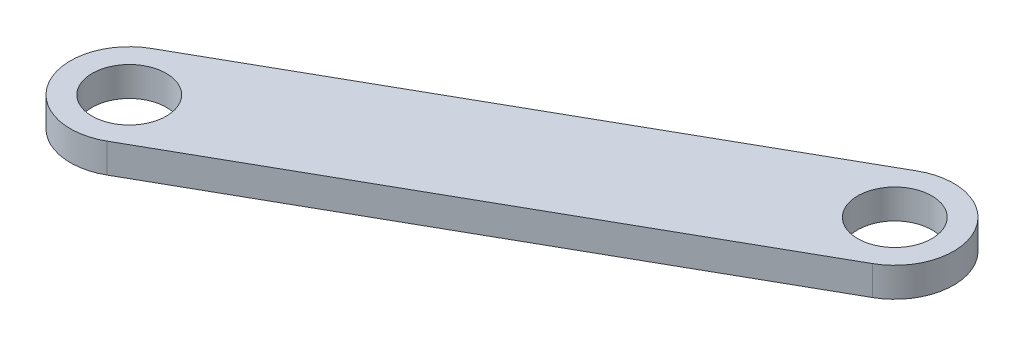
ISO-10303-21;
HEADER;
FILE_DESCRIPTION(('STEP AP214'),'2;1');
FILE_NAME('part.step','',(''),(''),'','','');
FILE_SCHEMA(('AUTOMOTIVE_DESIGN { 1 0 10303 214 1 1 1 1 }'));
ENDSEC;
DATA;
#1=APPLICATION_CONTEXT('core data for automotive mechanical design processes');
#2=APPLICATION_PROTOCOL_DEFINITION('international standard','automotive_design',2000,#1);
#3=PRODUCT_CONTEXT('',#1,'mechanical');
#4=PRODUCT('Part','Part','',(#3));
#5=PRODUCT_RELATED_PRODUCT_CATEGORY('part','',(#4));
#6=PRODUCT_DEFINITION_FORMATION('','',#4);
#7=PRODUCT_DEFINITION_CONTEXT('part definition',#1,'design');
#8=PRODUCT_DEFINITION('design','',#6,#7);
#9=PRODUCT_DEFINITION_SHAPE('','',#8);
#10=(LENGTH_UNIT() NAMED_UNIT(*) SI_UNIT(.MILLI.,.METRE.));
#11=(NAMED_UNIT(*) PLANE_ANGLE_UNIT() SI_UNIT($,.RADIAN.));
#12=(NAMED_UNIT(*) SI_UNIT($,.STERADIAN.) SOLID_ANGLE_UNIT());
#13=UNCERTAINTY_MEASURE_WITH_UNIT(LENGTH_MEASURE(1.E-05),#10,'distance_accuracy_value','');
#14=(GEOMETRIC_REPRESENTATION_CONTEXT(3) GLOBAL_UNCERTAINTY_ASSIGNED_CONTEXT((#13)) GLOBAL_UNIT_ASSIGNED_CONTEXT((#10,
#11,#12)) REPRESENTATION_CONTEXT('',''));
#15=CARTESIAN_POINT('',(0.,0.,0.));
#16=DIRECTION('',(0.,0.,1.));
#17=DIRECTION('',(1.,0.,0.));
#18=AXIS2_PLACEMENT_3D('',#15,#16,#17);
#19=CARTESIAN_POINT('',(0.,-1.5875,0.));
#20=DIRECTION('',(0.,1.,0.));
#21=DIRECTION('',(0.,0.,1.));
#22=AXIS2_PLACEMENT_3D('',#19,#20,#21);
#23=CYLINDRICAL_SURFACE('',#22,3.175);
#24=CARTESIAN_POINT('',(0.,0.,0.));
#25=DIRECTION('',(0.,1.,0.));
#26=DIRECTION('',(0.,0.,-1.));
#27=AXIS2_PLACEMENT_3D('',#24,#25,#26);
#28=CIRCLE('',#27,3.175);
#29=CARTESIAN_POINT('',(1.56402198628514,0.,2.76305270062239));
#30=VERTEX_POINT('',#29);
#31=CARTESIAN_POINT('',(-1.56402198628514,0.,-2.76305270062239));
#32=VERTEX_POINT('',#31);
#33=EDGE_CURVE('E110',#30,#32,#28,.T.);
#34=ORIENTED_EDGE('',*,*,#33,.F.);
#35=DIRECTION('',(0.,1.,0.));
#36=VECTOR('',#35,1.);
#37=CARTESIAN_POINT('',(1.56402198628514,-1.5875,2.76305270062239));
#38=LINE('',#37,#36);
#39=CARTESIAN_POINT('',(1.56402198628514,-1.5875,2.76305270062239));
#40=VERTEX_POINT('',#39);
#41=EDGE_CURVE('E11',#40,#30,#38,.T.);
#42=ORIENTED_EDGE('',*,*,#41,.F.);
#43=CARTESIAN_POINT('',(0.,-1.5875,0.));
#44=DIRECTION('',(0.,1.,0.));
#45=DIRECTION('',(0.,0.,-1.));
#46=AXIS2_PLACEMENT_3D('',#43,#44,#45);
#47=CIRCLE('',#46,3.175);
#48=CARTESIAN_POINT('',(-1.56402198628514,-1.5875,-2.76305270062239));
#49=VERTEX_POINT('',#48);
#50=EDGE_CURVE('E101',#40,#49,#47,.T.);
#51=ORIENTED_EDGE('',*,*,#50,.T.);
#52=DIRECTION('',(0.,1.,0.));
#53=VECTOR('',#52,1.);
#54=CARTESIAN_POINT('',(-1.56402198628514,-1.5875,-2.76305270062239));
#55=LINE('',#54,#53);
#56=EDGE_CURVE('E42',#49,#32,#55,.T.);
#57=ORIENTED_EDGE('',*,*,#56,.T.);
#58=EDGE_LOOP('',(#34,#42,#51,#57));
#59=FACE_BOUND('',#58,.T.);
#60=ADVANCED_FACE('F39',(#59),#23,.T.);
#61=CARTESIAN_POINT('',(1.56402198628514,-1.5875,2.76305270062239));
#62=DIRECTION('',(0.492605350011069,0.,0.870252819093666));
#63=DIRECTION('',(0.870252819093666,0.,-0.492605350011069));
#64=AXIS2_PLACEMENT_3D('',#61,#62,#63);
#65=PLANE('',#64);
#66=DIRECTION('',(0.870252819093666,0.,-0.492605350011069));
#67=VECTOR('',#66,1.);
#68=CARTESIAN_POINT('',(1.56402198628514,0.,2.76305270062239));
#69=LINE('',#68,#67);
#70=CARTESIAN_POINT('',(-24.7985574957149,0.,17.6855527006224));
#71=VERTEX_POINT('',#70);
#72=EDGE_CURVE('E104',#71,#30,#69,.T.);
#73=ORIENTED_EDGE('',*,*,#72,.F.);
#74=DIRECTION('',(0.,1.,0.));
#75=VECTOR('',#74,1.);
#76=CARTESIAN_POINT('',(-24.7985574957149,-1.5875,17.6855527006224));
#77=LINE('',#76,#75);
#78=CARTESIAN_POINT('',(-24.7985574957149,-1.5875,17.6855527006224));
#79=VERTEX_POINT('',#78);
#80=EDGE_CURVE('E49',#79,#71,#77,.T.);
#81=ORIENTED_EDGE('',*,*,#80,.F.);
#82=DIRECTION('',(0.870252819093666,0.,-0.492605350011069));
#83=VECTOR('',#82,1.);
#84=CARTESIAN_POINT('',(1.56402198628514,-1.5875,2.76305270062239));
#85=LINE('',#84,#83);
#86=EDGE_CURVE('E96',#79,#40,#85,.T.);
#87=ORIENTED_EDGE('',*,*,#86,.T.);
#88=ORIENTED_EDGE('',*,*,#41,.T.);
#89=EDGE_LOOP('',(#73,#81,#87,#88));
#90=FACE_BOUND('',#89,.T.);
#91=ADVANCED_FACE('F127',(#90),#65,.T.);
#92=CARTESIAN_POINT('',(-26.362579482,-1.5875,14.9225));
#93=DIRECTION('',(0.,1.,0.));
#94=DIRECTION('',(0.,0.,1.));
#95=AXIS2_PLACEMENT_3D('',#92,#93,#94);
#96=CYLINDRICAL_SURFACE('',#95,3.175);
#97=CARTESIAN_POINT('',(-26.362579482,0.,14.9225));
#98=DIRECTION('',(0.,1.,0.));
#99=DIRECTION('',(0.,0.,-1.));
#100=AXIS2_PLACEMENT_3D('',#97,#98,#99);
#101=CIRCLE('',#100,3.175);
#102=CARTESIAN_POINT('',(-27.9266014682851,0.,12.1594472993776));
#103=VERTEX_POINT('',#102);
#104=EDGE_CURVE('E90',#103,#71,#101,.T.);
#105=ORIENTED_EDGE('',*,*,#104,.F.);
#106=DIRECTION('',(0.,1.,0.));
#107=VECTOR('',#106,1.);
#108=CARTESIAN_POINT('',(-27.9266014682851,-1.5875,12.1594472993776));
#109=LINE('',#108,#107);
#110=CARTESIAN_POINT('',(-27.9266014682851,-1.5875,12.1594472993776));
#111=VERTEX_POINT('',#110);
#112=EDGE_CURVE('E85',#111,#103,#109,.T.);
#113=ORIENTED_EDGE('',*,*,#112,.F.);
#114=CARTESIAN_POINT('',(-26.362579482,-1.5875,14.9225));
#115=DIRECTION('',(0.,1.,0.));
#116=DIRECTION('',(0.,0.,-1.));
#117=AXIS2_PLACEMENT_3D('',#114,#115,#116);
#118=CIRCLE('',#117,3.175);
#119=EDGE_CURVE('E88',#111,#79,#118,.T.);
#120=ORIENTED_EDGE('',*,*,#119,.T.);
#121=ORIENTED_EDGE('',*,*,#80,.T.);
#122=EDGE_LOOP('',(#105,#113,#120,#121));
#123=FACE_BOUND('',#122,.T.);
#124=ADVANCED_FACE('F87',(#123),#96,.T.);
#125=CARTESIAN_POINT('',(-1.56402198628514,-1.5875,-2.76305270062239));
#126=DIRECTION('',(-0.492605350011069,0.,-0.870252819093666));
#127=DIRECTION('',(-0.870252819093666,0.,0.492605350011069));
#128=AXIS2_PLACEMENT_3D('',#125,#126,#127);
#129=PLANE('',#128);
#130=DIRECTION('',(-0.870252819093666,0.,0.492605350011069));
#131=VECTOR('',#130,1.);
#132=CARTESIAN_POINT('',(-1.56402198628514,0.,-2.76305270062239));
#133=LINE('',#132,#131);
#134=EDGE_CURVE('E114',#32,#103,#133,.T.);
#135=ORIENTED_EDGE('',*,*,#134,.F.);
#136=ORIENTED_EDGE('',*,*,#56,.F.);
#137=DIRECTION('',(-0.870252819093666,0.,0.492605350011069));
#138=VECTOR('',#137,1.);
#139=CARTESIAN_POINT('',(-1.56402198628514,-1.5875,-2.76305270062239));
#140=LINE('',#139,#138);
#141=EDGE_CURVE('E95',#49,#111,#140,.T.);
#142=ORIENTED_EDGE('',*,*,#141,.T.);
#143=ORIENTED_EDGE('',*,*,#112,.T.);
#144=EDGE_LOOP('',(#135,#136,#142,#143));
#145=FACE_BOUND('',#144,.T.);
#146=ADVANCED_FACE('F99',(#145),#129,.T.);
#147=CARTESIAN_POINT('',(0.,-1.5875,0.));
#148=DIRECTION('',(0.,-1.,0.));
#149=DIRECTION('',(0.,0.,-1.));
#150=AXIS2_PLACEMENT_3D('',#147,#148,#149);
#151=PLANE('',#150);
#152=CARTESIAN_POINT('',(-26.362579482,-1.5875,14.9225));
#153=DIRECTION('',(0.,1.,0.));
#154=DIRECTION('',(0.,0.,1.));
#155=AXIS2_PLACEMENT_3D('',#152,#153,#154);
#156=CIRCLE('',#155,2.);
#157=CARTESIAN_POINT('',(-26.362579482,-1.5875,16.9225));
#158=VERTEX_POINT('',#157);
#159=EDGE_CURVE('E160',#158,#158,#156,.T.);
#160=ORIENTED_EDGE('',*,*,#159,.T.);
#161=EDGE_LOOP('',(#160));
#162=FACE_BOUND('',#161,.T.);
#163=CARTESIAN_POINT('',(0.,-1.5875,0.));
#164=DIRECTION('',(0.,1.,0.));
#165=DIRECTION('',(0.,0.,1.));
#166=AXIS2_PLACEMENT_3D('',#163,#164,#165);
#167=CIRCLE('',#166,2.);
#168=CARTESIAN_POINT('',(0.,-1.5875,2.));
#169=VERTEX_POINT('',#168);
#170=EDGE_CURVE('E115',#169,#169,#167,.T.);
#171=ORIENTED_EDGE('',*,*,#170,.T.);
#172=EDGE_LOOP('',(#171));
#173=FACE_BOUND('',#172,.T.);
#174=ORIENTED_EDGE('',*,*,#50,.F.);
#175=ORIENTED_EDGE('',*,*,#86,.F.);
#176=ORIENTED_EDGE('',*,*,#119,.F.);
#177=ORIENTED_EDGE('',*,*,#141,.F.);
#178=EDGE_LOOP('',(#174,#175,#176,#177));
#179=FACE_BOUND('',#178,.T.);
#180=ADVANCED_FACE('F94',(#162,#173,#179),#151,.T.);
#181=CARTESIAN_POINT('',(0.,0.,0.));
#182=DIRECTION('',(0.,-1.,0.));
#183=DIRECTION('',(0.,0.,-1.));
#184=AXIS2_PLACEMENT_3D('',#181,#182,#183);
#185=PLANE('',#184);
#186=CARTESIAN_POINT('',(-26.362579482,0.,14.9225));
#187=DIRECTION('',(0.,1.,0.));
#188=DIRECTION('',(0.,0.,1.));
#189=AXIS2_PLACEMENT_3D('',#186,#187,#188);
#190=CIRCLE('',#189,2.);
#191=CARTESIAN_POINT('',(-26.362579482,0.,16.9225));
#192=VERTEX_POINT('',#191);
#193=EDGE_CURVE('E163',#192,#192,#190,.T.);
#194=ORIENTED_EDGE('',*,*,#193,.F.);
#195=EDGE_LOOP('',(#194));
#196=FACE_BOUND('',#195,.T.);
#197=CARTESIAN_POINT('',(0.,0.,0.));
#198=DIRECTION('',(0.,1.,0.));
#199=DIRECTION('',(0.,0.,1.));
#200=AXIS2_PLACEMENT_3D('',#197,#198,#199);
#201=CIRCLE('',#200,2.);
#202=CARTESIAN_POINT('',(0.,0.,2.));
#203=VERTEX_POINT('',#202);
#204=EDGE_CURVE('E167',#203,#203,#201,.T.);
#205=ORIENTED_EDGE('',*,*,#204,.F.);
#206=EDGE_LOOP('',(#205));
#207=FACE_BOUND('',#206,.T.);
#208=ORIENTED_EDGE('',*,*,#33,.T.);
#209=ORIENTED_EDGE('',*,*,#134,.T.);
#210=ORIENTED_EDGE('',*,*,#104,.T.);
#211=ORIENTED_EDGE('',*,*,#72,.T.);
#212=EDGE_LOOP('',(#208,#209,#210,#211));
#213=FACE_BOUND('',#212,.T.);
#214=ADVANCED_FACE('F126',(#196,#207,#213),#185,.F.);
#215=CARTESIAN_POINT('',(0.,-1.5875,0.));
#216=DIRECTION('',(0.,1.,0.));
#217=DIRECTION('',(0.,0.,1.));
#218=AXIS2_PLACEMENT_3D('',#215,#216,#217);
#219=CYLINDRICAL_SURFACE('',#218,2.);
#220=ORIENTED_EDGE('',*,*,#170,.F.);
#221=EDGE_LOOP('',(#220));
#222=FACE_BOUND('',#221,.T.);
#223=ORIENTED_EDGE('',*,*,#204,.T.);
#224=EDGE_LOOP('',(#223));
#225=FACE_BOUND('',#224,.T.);
#226=ADVANCED_FACE('F145',(#222,#225),#219,.F.);
#227=CARTESIAN_POINT('',(-26.362579482,-1.5875,14.9225));
#228=DIRECTION('',(0.,1.,0.));
#229=DIRECTION('',(0.,0.,1.));
#230=AXIS2_PLACEMENT_3D('',#227,#228,#229);
#231=CYLINDRICAL_SURFACE('',#230,2.);
#232=ORIENTED_EDGE('',*,*,#159,.F.);
#233=EDGE_LOOP('',(#232));
#234=FACE_BOUND('',#233,.T.);
#235=ORIENTED_EDGE('',*,*,#193,.T.);
#236=EDGE_LOOP('',(#235));
#237=FACE_BOUND('',#236,.T.);
#238=ADVANCED_FACE('F152',(#234,#237),#231,.F.);
#239=CLOSED_SHELL('',(#60,#91,#124,#146,#180,#214,#226,#238));
#240=MANIFOLD_SOLID_BREP('B2',#239);
#241=ADVANCED_BREP_SHAPE_REPRESENTATION('',(#18,#240),#14);
#242=SHAPE_DEFINITION_REPRESENTATION(#9,#241);
ENDSEC;
END-ISO-10303-21;
